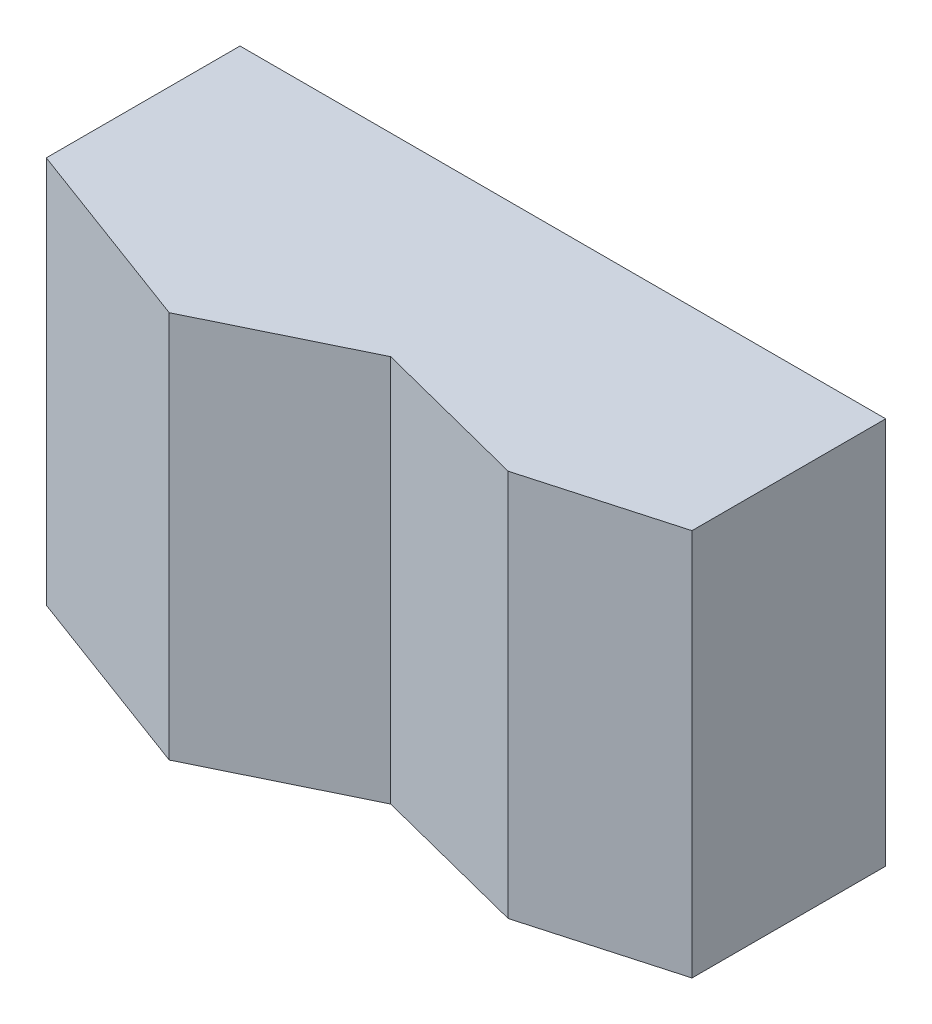
ISO-10303-21;
HEADER;
FILE_DESCRIPTION(('STEP AP214'),'2;1');
FILE_NAME('part.step','',(''),(''),'','','');
FILE_SCHEMA(('AUTOMOTIVE_DESIGN { 1 0 10303 214 1 1 1 1 }'));
ENDSEC;
DATA;
#1=APPLICATION_CONTEXT('core data for automotive mechanical design processes');
#2=APPLICATION_PROTOCOL_DEFINITION('international standard','automotive_design',2000,#1);
#3=PRODUCT_CONTEXT('',#1,'mechanical');
#4=PRODUCT('Part','Part','',(#3));
#5=PRODUCT_RELATED_PRODUCT_CATEGORY('part','',(#4));
#6=PRODUCT_DEFINITION_FORMATION('','',#4);
#7=PRODUCT_DEFINITION_CONTEXT('part definition',#1,'design');
#8=PRODUCT_DEFINITION('design','',#6,#7);
#9=PRODUCT_DEFINITION_SHAPE('','',#8);
#10=(LENGTH_UNIT() NAMED_UNIT(*) SI_UNIT(.MILLI.,.METRE.));
#11=(NAMED_UNIT(*) PLANE_ANGLE_UNIT() SI_UNIT($,.RADIAN.));
#12=(NAMED_UNIT(*) SI_UNIT($,.STERADIAN.) SOLID_ANGLE_UNIT());
#13=UNCERTAINTY_MEASURE_WITH_UNIT(LENGTH_MEASURE(1.E-05),#10,'distance_accuracy_value','');
#14=(GEOMETRIC_REPRESENTATION_CONTEXT(3) GLOBAL_UNCERTAINTY_ASSIGNED_CONTEXT((#13)) GLOBAL_UNIT_ASSIGNED_CONTEXT((#10,
#11,#12)) REPRESENTATION_CONTEXT('',''));
#15=CARTESIAN_POINT('',(0.,0.,0.));
#16=DIRECTION('',(0.,0.,1.));
#17=DIRECTION('',(1.,0.,0.));
#18=AXIS2_PLACEMENT_3D('',#15,#16,#17);
#19=CARTESIAN_POINT('',(0.,0.,3.));
#20=DIRECTION('',(1.,0.,0.));
#21=DIRECTION('',(0.,0.,-1.));
#22=AXIS2_PLACEMENT_3D('',#19,#20,#21);
#23=PLANE('',#22);
#24=DIRECTION('',(0.,-1.,0.));
#25=VECTOR('',#24,1.);
#26=CARTESIAN_POINT('',(0.,0.,0.));
#27=LINE('',#26,#25);
#28=CARTESIAN_POINT('',(0.,6.,0.));
#29=VERTEX_POINT('',#28);
#30=CARTESIAN_POINT('',(0.,0.,0.));
#31=VERTEX_POINT('',#30);
#32=EDGE_CURVE('E275',#29,#31,#27,.T.);
#33=ORIENTED_EDGE('',*,*,#32,.T.);
#34=DIRECTION('',(0.,0.,-1.));
#35=VECTOR('',#34,1.);
#36=CARTESIAN_POINT('',(0.,0.,3.));
#37=LINE('',#36,#35);
#38=CARTESIAN_POINT('',(0.,0.,3.));
#39=VERTEX_POINT('',#38);
#40=EDGE_CURVE('E11',#39,#31,#37,.T.);
#41=ORIENTED_EDGE('',*,*,#40,.F.);
#42=DIRECTION('',(0.,-1.,0.));
#43=VECTOR('',#42,1.);
#44=CARTESIAN_POINT('',(0.,0.,3.));
#45=LINE('',#44,#43);
#46=CARTESIAN_POINT('',(0.,6.,3.));
#47=VERTEX_POINT('',#46);
#48=EDGE_CURVE('E279',#47,#39,#45,.T.);
#49=ORIENTED_EDGE('',*,*,#48,.F.);
#50=DIRECTION('',(0.,0.,-1.));
#51=VECTOR('',#50,1.);
#52=CARTESIAN_POINT('',(0.,6.,3.));
#53=LINE('',#52,#51);
#54=EDGE_CURVE('E287',#47,#29,#53,.T.);
#55=ORIENTED_EDGE('',*,*,#54,.T.);
#56=EDGE_LOOP('',(#33,#41,#49,#55));
#57=FACE_BOUND('',#56,.T.);
#58=ADVANCED_FACE('F41',(#57),#23,.F.);
#59=CARTESIAN_POINT('',(0.,0.,3.));
#60=DIRECTION('',(0.,1.,0.));
#61=DIRECTION('',(0.,0.,1.));
#62=AXIS2_PLACEMENT_3D('',#59,#60,#61);
#63=PLANE('',#62);
#64=DIRECTION('',(1.,0.,0.));
#65=VECTOR('',#64,1.);
#66=CARTESIAN_POINT('',(0.,0.,0.));
#67=LINE('',#66,#65);
#68=CARTESIAN_POINT('',(10.,0.,0.));
#69=VERTEX_POINT('',#68);
#70=EDGE_CURVE('E291',#31,#69,#67,.T.);
#71=ORIENTED_EDGE('',*,*,#70,.T.);
#72=DIRECTION('',(0.,0.,-1.));
#73=VECTOR('',#72,1.);
#74=CARTESIAN_POINT('',(10.,0.,3.));
#75=LINE('',#74,#73);
#76=CARTESIAN_POINT('',(10.,0.,3.));
#77=VERTEX_POINT('',#76);
#78=EDGE_CURVE('E49',#77,#69,#75,.T.);
#79=ORIENTED_EDGE('',*,*,#78,.F.);
#80=DIRECTION('',(0.962490655943044,0.,-0.271314830450401));
#81=VECTOR('',#80,1.);
#82=CARTESIAN_POINT('',(1.51953133960514,0.,5.39054467960583));
#83=LINE('',#82,#81);
#84=CARTESIAN_POINT('',(7.77951864190933,0.,3.62592765910893));
#85=VERTEX_POINT('',#84);
#86=EDGE_CURVE('E194',#85,#77,#83,.T.);
#87=ORIENTED_EDGE('',*,*,#86,.F.);
#88=DIRECTION('',(0.968775623637578,0.,0.247939087369505));
#89=VECTOR('',#88,1.);
#90=CARTESIAN_POINT('',(-0.39270168979148,0.,1.53440842453493));
#91=LINE('',#90,#89);
#92=CARTESIAN_POINT('',(5.33382335143032,0.,3.));
#93=VERTEX_POINT('',#92);
#94=EDGE_CURVE('E245',#93,#85,#91,.T.);
#95=ORIENTED_EDGE('',*,*,#94,.F.);
#96=DIRECTION('',(0.8986995930781,0.,-0.438564751663034));
#97=VECTOR('',#96,1.);
#98=CARTESIAN_POINT('',(2.20831636199165,0.,4.52524515110705));
#99=LINE('',#98,#97);
#100=CARTESIAN_POINT('',(3.02868526155356,0.,4.12490572124689));
#101=VERTEX_POINT('',#100);
#102=EDGE_CURVE('E255',#101,#93,#99,.T.);
#103=ORIENTED_EDGE('',*,*,#102,.F.);
#104=DIRECTION('',(0.937428759251605,0.,0.348177140731548));
#105=VECTOR('',#104,1.);
#106=CARTESIAN_POINT('',(-0.979173795107241,0.,2.63631803601601));
#107=LINE('',#106,#105);
#108=EDGE_CURVE('E263',#39,#101,#107,.T.);
#109=ORIENTED_EDGE('',*,*,#108,.F.);
#110=ORIENTED_EDGE('',*,*,#40,.T.);
#111=EDGE_LOOP('',(#71,#79,#87,#95,#103,#109,#110));
#112=FACE_BOUND('',#111,.T.);
#113=ADVANCED_FACE('F328',(#112),#63,.F.);
#114=CARTESIAN_POINT('',(10.,0.,3.));
#115=DIRECTION('',(-1.,0.,0.));
#116=DIRECTION('',(0.,0.,1.));
#117=AXIS2_PLACEMENT_3D('',#114,#115,#116);
#118=PLANE('',#117);
#119=DIRECTION('',(0.,1.,0.));
#120=VECTOR('',#119,1.);
#121=CARTESIAN_POINT('',(10.,0.,0.));
#122=LINE('',#121,#120);
#123=CARTESIAN_POINT('',(10.,6.,0.));
#124=VERTEX_POINT('',#123);
#125=EDGE_CURVE('E294',#69,#124,#122,.T.);
#126=ORIENTED_EDGE('',*,*,#125,.T.);
#127=DIRECTION('',(0.,0.,-1.));
#128=VECTOR('',#127,1.);
#129=CARTESIAN_POINT('',(10.,6.,3.));
#130=LINE('',#129,#128);
#131=CARTESIAN_POINT('',(10.,6.,3.));
#132=VERTEX_POINT('',#131);
#133=EDGE_CURVE('E302',#132,#124,#130,.T.);
#134=ORIENTED_EDGE('',*,*,#133,.F.);
#135=DIRECTION('',(0.,1.,0.));
#136=VECTOR('',#135,1.);
#137=CARTESIAN_POINT('',(10.,0.,3.));
#138=LINE('',#137,#136);
#139=EDGE_CURVE('E282',#77,#132,#138,.T.);
#140=ORIENTED_EDGE('',*,*,#139,.F.);
#141=ORIENTED_EDGE('',*,*,#78,.T.);
#142=EDGE_LOOP('',(#126,#134,#140,#141));
#143=FACE_BOUND('',#142,.T.);
#144=ADVANCED_FACE('F310',(#143),#118,.F.);
#145=CARTESIAN_POINT('',(0.,6.,3.));
#146=DIRECTION('',(0.,-1.,0.));
#147=DIRECTION('',(0.,0.,-1.));
#148=AXIS2_PLACEMENT_3D('',#145,#146,#147);
#149=PLANE('',#148);
#150=DIRECTION('',(-1.,0.,0.));
#151=VECTOR('',#150,1.);
#152=CARTESIAN_POINT('',(0.,6.,0.));
#153=LINE('',#152,#151);
#154=EDGE_CURVE('E283',#124,#29,#153,.T.);
#155=ORIENTED_EDGE('',*,*,#154,.T.);
#156=ORIENTED_EDGE('',*,*,#54,.F.);
#157=DIRECTION('',(0.937428759251605,0.,0.348177140731548));
#158=VECTOR('',#157,1.);
#159=CARTESIAN_POINT('',(-0.979173795107241,6.,2.63631803601601));
#160=LINE('',#159,#158);
#161=CARTESIAN_POINT('',(3.02868526155356,6.,4.12490572124689));
#162=VERTEX_POINT('',#161);
#163=EDGE_CURVE('E262',#47,#162,#160,.T.);
#164=ORIENTED_EDGE('',*,*,#163,.T.);
#165=DIRECTION('',(0.8986995930781,0.,-0.438564751663034));
#166=VECTOR('',#165,1.);
#167=CARTESIAN_POINT('',(2.20831636199165,6.,4.52524515110705));
#168=LINE('',#167,#166);
#169=CARTESIAN_POINT('',(5.33382335143032,6.,3.));
#170=VERTEX_POINT('',#169);
#171=EDGE_CURVE('E259',#162,#170,#168,.T.);
#172=ORIENTED_EDGE('',*,*,#171,.T.);
#173=DIRECTION('',(0.968775623637578,0.,0.247939087369505));
#174=VECTOR('',#173,1.);
#175=CARTESIAN_POINT('',(-0.39270168979148,6.,1.53440842453493));
#176=LINE('',#175,#174);
#177=CARTESIAN_POINT('',(7.77951864190933,6.,3.62592765910893));
#178=VERTEX_POINT('',#177);
#179=EDGE_CURVE('E252',#170,#178,#176,.T.);
#180=ORIENTED_EDGE('',*,*,#179,.T.);
#181=DIRECTION('',(0.962490655943044,0.,-0.271314830450401));
#182=VECTOR('',#181,1.);
#183=CARTESIAN_POINT('',(1.51953133960514,6.,5.39054467960583));
#184=LINE('',#183,#182);
#185=EDGE_CURVE('E248',#178,#132,#184,.T.);
#186=ORIENTED_EDGE('',*,*,#185,.T.);
#187=ORIENTED_EDGE('',*,*,#133,.T.);
#188=EDGE_LOOP('',(#155,#156,#164,#172,#180,#186,#187));
#189=FACE_BOUND('',#188,.T.);
#190=ADVANCED_FACE('F319',(#189),#149,.F.);
#191=CARTESIAN_POINT('',(0.,0.,0.));
#192=DIRECTION('',(0.,0.,-1.));
#193=DIRECTION('',(-1.,0.,0.));
#194=AXIS2_PLACEMENT_3D('',#191,#192,#193);
#195=PLANE('',#194);
#196=DIRECTION('',(0.,-1.,0.));
#197=VECTOR('',#196,1.);
#198=CARTESIAN_POINT('',(3.,4.5,0.));
#199=LINE('',#198,#197);
#200=CARTESIAN_POINT('',(3.,4.5,0.));
#201=VERTEX_POINT('',#200);
#202=CARTESIAN_POINT('',(3.,2.5,0.));
#203=VERTEX_POINT('',#202);
#204=EDGE_CURVE('E56',#201,#203,#199,.T.);
#205=ORIENTED_EDGE('',*,*,#204,.F.);
#206=DIRECTION('',(1.,0.,0.));
#207=VECTOR('',#206,1.);
#208=CARTESIAN_POINT('',(3.,4.5,0.));
#209=LINE('',#208,#207);
#210=CARTESIAN_POINT('',(2.5,4.5,0.));
#211=VERTEX_POINT('',#210);
#212=EDGE_CURVE('E171',#211,#201,#209,.T.);
#213=ORIENTED_EDGE('',*,*,#212,.F.);
#214=DIRECTION('',(0.,1.,0.));
#215=VECTOR('',#214,1.);
#216=CARTESIAN_POINT('',(2.5,4.5,0.));
#217=LINE('',#216,#215);
#218=CARTESIAN_POINT('',(2.5,2.5,0.));
#219=VERTEX_POINT('',#218);
#220=EDGE_CURVE('E175',#219,#211,#217,.T.);
#221=ORIENTED_EDGE('',*,*,#220,.F.);
#222=DIRECTION('',(-1.,0.,0.));
#223=VECTOR('',#222,1.);
#224=CARTESIAN_POINT('',(3.,2.5,0.));
#225=LINE('',#224,#223);
#226=EDGE_CURVE('E184',#203,#219,#225,.T.);
#227=ORIENTED_EDGE('',*,*,#226,.F.);
#228=EDGE_LOOP('',(#205,#213,#221,#227));
#229=FACE_BOUND('',#228,.T.);
#230=DIRECTION('',(0.,-1.,0.));
#231=VECTOR('',#230,1.);
#232=CARTESIAN_POINT('',(7.,4.5,0.));
#233=LINE('',#232,#231);
#234=CARTESIAN_POINT('',(7.,4.5,0.));
#235=VERTEX_POINT('',#234);
#236=CARTESIAN_POINT('',(7.,1.5,0.));
#237=VERTEX_POINT('',#236);
#238=EDGE_CURVE('E64',#235,#237,#233,.T.);
#239=ORIENTED_EDGE('',*,*,#238,.F.);
#240=DIRECTION('',(1.,0.,0.));
#241=VECTOR('',#240,1.);
#242=CARTESIAN_POINT('',(7.,4.5,0.));
#243=LINE('',#242,#241);
#244=CARTESIAN_POINT('',(6.,4.5,0.));
#245=VERTEX_POINT('',#244);
#246=EDGE_CURVE('E205',#245,#235,#243,.T.);
#247=ORIENTED_EDGE('',*,*,#246,.F.);
#248=DIRECTION('',(0.,1.,0.));
#249=VECTOR('',#248,1.);
#250=CARTESIAN_POINT('',(6.,4.5,0.));
#251=LINE('',#250,#249);
#252=CARTESIAN_POINT('',(6.,1.5,0.));
#253=VERTEX_POINT('',#252);
#254=EDGE_CURVE('E224',#253,#245,#251,.T.);
#255=ORIENTED_EDGE('',*,*,#254,.F.);
#256=DIRECTION('',(-1.,0.,0.));
#257=VECTOR('',#256,1.);
#258=CARTESIAN_POINT('',(7.,1.5,0.));
#259=LINE('',#258,#257);
#260=EDGE_CURVE('E220',#237,#253,#259,.T.);
#261=ORIENTED_EDGE('',*,*,#260,.F.);
#262=EDGE_LOOP('',(#239,#247,#255,#261));
#263=FACE_BOUND('',#262,.T.);
#264=ORIENTED_EDGE('',*,*,#32,.F.);
#265=ORIENTED_EDGE('',*,*,#154,.F.);
#266=ORIENTED_EDGE('',*,*,#125,.F.);
#267=ORIENTED_EDGE('',*,*,#70,.F.);
#268=EDGE_LOOP('',(#264,#265,#266,#267));
#269=FACE_BOUND('',#268,.T.);
#270=ADVANCED_FACE('F316',(#229,#263,#269),#195,.T.);
#271=CARTESIAN_POINT('',(2.20831636199165,6.,4.52524515110705));
#272=DIRECTION('',(-0.438564751663034,0.,-0.8986995930781));
#273=DIRECTION('',(-0.8986995930781,0.,0.438564751663034));
#274=AXIS2_PLACEMENT_3D('',#271,#272,#273);
#275=PLANE('',#274);
#276=ORIENTED_EDGE('',*,*,#102,.T.);
#277=DIRECTION('',(0.,-1.,0.));
#278=VECTOR('',#277,1.);
#279=CARTESIAN_POINT('',(5.33382335143032,6.,3.));
#280=LINE('',#279,#278);
#281=EDGE_CURVE('E271',#170,#93,#280,.T.);
#282=ORIENTED_EDGE('',*,*,#281,.F.);
#283=ORIENTED_EDGE('',*,*,#171,.F.);
#284=DIRECTION('',(0.,-1.,0.));
#285=VECTOR('',#284,1.);
#286=CARTESIAN_POINT('',(3.02868526155356,6.,4.12490572124689));
#287=LINE('',#286,#285);
#288=EDGE_CURVE('E266',#162,#101,#287,.T.);
#289=ORIENTED_EDGE('',*,*,#288,.T.);
#290=EDGE_LOOP('',(#276,#282,#283,#289));
#291=FACE_BOUND('',#290,.T.);
#292=ADVANCED_FACE('F332',(#291),#275,.F.);
#293=CARTESIAN_POINT('',(-0.979173795107241,6.,2.63631803601601));
#294=DIRECTION('',(0.348177140731548,0.,-0.937428759251605));
#295=DIRECTION('',(-0.937428759251605,0.,-0.348177140731548));
#296=AXIS2_PLACEMENT_3D('',#293,#294,#295);
#297=PLANE('',#296);
#298=ORIENTED_EDGE('',*,*,#108,.T.);
#299=ORIENTED_EDGE('',*,*,#288,.F.);
#300=ORIENTED_EDGE('',*,*,#163,.F.);
#301=ORIENTED_EDGE('',*,*,#48,.T.);
#302=EDGE_LOOP('',(#298,#299,#300,#301));
#303=FACE_BOUND('',#302,.T.);
#304=ADVANCED_FACE('F325',(#303),#297,.F.);
#305=CARTESIAN_POINT('',(1.51953133960514,6.,5.39054467960583));
#306=DIRECTION('',(-0.271314830450401,0.,-0.962490655943044));
#307=DIRECTION('',(-0.962490655943044,0.,0.271314830450401));
#308=AXIS2_PLACEMENT_3D('',#305,#306,#307);
#309=PLANE('',#308);
#310=ORIENTED_EDGE('',*,*,#86,.T.);
#311=ORIENTED_EDGE('',*,*,#139,.T.);
#312=ORIENTED_EDGE('',*,*,#185,.F.);
#313=DIRECTION('',(0.,-1.,0.));
#314=VECTOR('',#313,1.);
#315=CARTESIAN_POINT('',(7.77951864190933,6.,3.62592765910893));
#316=LINE('',#315,#314);
#317=EDGE_CURVE('E241',#178,#85,#316,.T.);
#318=ORIENTED_EDGE('',*,*,#317,.T.);
#319=EDGE_LOOP('',(#310,#311,#312,#318));
#320=FACE_BOUND('',#319,.T.);
#321=ADVANCED_FACE('F340',(#320),#309,.F.);
#322=CARTESIAN_POINT('',(-0.39270168979148,6.,1.53440842453493));
#323=DIRECTION('',(0.247939087369505,0.,-0.968775623637577));
#324=DIRECTION('',(-0.968775623637578,0.,-0.247939087369505));
#325=AXIS2_PLACEMENT_3D('',#322,#323,#324);
#326=PLANE('',#325);
#327=ORIENTED_EDGE('',*,*,#94,.T.);
#328=ORIENTED_EDGE('',*,*,#317,.F.);
#329=ORIENTED_EDGE('',*,*,#179,.F.);
#330=ORIENTED_EDGE('',*,*,#281,.T.);
#331=EDGE_LOOP('',(#327,#328,#329,#330));
#332=FACE_BOUND('',#331,.T.);
#333=ADVANCED_FACE('F336',(#332),#326,.F.);
#334=CARTESIAN_POINT('',(7.,4.5,1.5));
#335=DIRECTION('',(1.,0.,0.));
#336=DIRECTION('',(0.,0.,-1.));
#337=AXIS2_PLACEMENT_3D('',#334,#335,#336);
#338=PLANE('',#337);
#339=ORIENTED_EDGE('',*,*,#238,.T.);
#340=DIRECTION('',(0.,0.,-1.));
#341=VECTOR('',#340,1.);
#342=CARTESIAN_POINT('',(7.,1.5,1.5));
#343=LINE('',#342,#341);
#344=CARTESIAN_POINT('',(7.,1.5,1.5));
#345=VERTEX_POINT('',#344);
#346=EDGE_CURVE('E217',#345,#237,#343,.T.);
#347=ORIENTED_EDGE('',*,*,#346,.F.);
#348=DIRECTION('',(0.,-1.,0.));
#349=VECTOR('',#348,1.);
#350=CARTESIAN_POINT('',(7.,4.5,1.5));
#351=LINE('',#350,#349);
#352=CARTESIAN_POINT('',(7.,4.5,1.5));
#353=VERTEX_POINT('',#352);
#354=EDGE_CURVE('E200',#353,#345,#351,.T.);
#355=ORIENTED_EDGE('',*,*,#354,.F.);
#356=DIRECTION('',(0.,0.,-1.));
#357=VECTOR('',#356,1.);
#358=CARTESIAN_POINT('',(7.,4.5,1.5));
#359=LINE('',#358,#357);
#360=EDGE_CURVE('E185',#353,#235,#359,.T.);
#361=ORIENTED_EDGE('',*,*,#360,.T.);
#362=EDGE_LOOP('',(#339,#347,#355,#361));
#363=FACE_BOUND('',#362,.T.);
#364=ADVANCED_FACE('F347',(#363),#338,.F.);
#365=CARTESIAN_POINT('',(7.,4.5,1.5));
#366=DIRECTION('',(0.,1.,0.));
#367=DIRECTION('',(0.,0.,1.));
#368=AXIS2_PLACEMENT_3D('',#365,#366,#367);
#369=PLANE('',#368);
#370=ORIENTED_EDGE('',*,*,#246,.T.);
#371=ORIENTED_EDGE('',*,*,#360,.F.);
#372=DIRECTION('',(1.,0.,0.));
#373=VECTOR('',#372,1.);
#374=CARTESIAN_POINT('',(7.,4.5,1.5));
#375=LINE('',#374,#373);
#376=CARTESIAN_POINT('',(6.,4.5,1.5));
#377=VERTEX_POINT('',#376);
#378=EDGE_CURVE('E213',#377,#353,#375,.T.);
#379=ORIENTED_EDGE('',*,*,#378,.F.);
#380=DIRECTION('',(0.,0.,-1.));
#381=VECTOR('',#380,1.);
#382=CARTESIAN_POINT('',(6.,4.5,1.5));
#383=LINE('',#382,#381);
#384=EDGE_CURVE('E233',#377,#245,#383,.T.);
#385=ORIENTED_EDGE('',*,*,#384,.T.);
#386=EDGE_LOOP('',(#370,#371,#379,#385));
#387=FACE_BOUND('',#386,.T.);
#388=ADVANCED_FACE('F400',(#387),#369,.F.);
#389=CARTESIAN_POINT('',(6.,4.5,1.5));
#390=DIRECTION('',(-1.,0.,0.));
#391=DIRECTION('',(0.,-1.,0.));
#392=AXIS2_PLACEMENT_3D('',#389,#390,#391);
#393=PLANE('',#392);
#394=ORIENTED_EDGE('',*,*,#254,.T.);
#395=ORIENTED_EDGE('',*,*,#384,.F.);
#396=DIRECTION('',(0.,1.,0.));
#397=VECTOR('',#396,1.);
#398=CARTESIAN_POINT('',(6.,4.5,1.5));
#399=LINE('',#398,#397);
#400=CARTESIAN_POINT('',(6.,1.5,1.5));
#401=VERTEX_POINT('',#400);
#402=EDGE_CURVE('E209',#401,#377,#399,.T.);
#403=ORIENTED_EDGE('',*,*,#402,.F.);
#404=DIRECTION('',(0.,0.,-1.));
#405=VECTOR('',#404,1.);
#406=CARTESIAN_POINT('',(6.,1.5,1.5));
#407=LINE('',#406,#405);
#408=EDGE_CURVE('E236',#401,#253,#407,.T.);
#409=ORIENTED_EDGE('',*,*,#408,.T.);
#410=EDGE_LOOP('',(#394,#395,#403,#409));
#411=FACE_BOUND('',#410,.T.);
#412=ADVANCED_FACE('F408',(#411),#393,.F.);
#413=CARTESIAN_POINT('',(7.,1.5,1.5));
#414=DIRECTION('',(0.,-1.,0.));
#415=DIRECTION('',(0.,0.,-1.));
#416=AXIS2_PLACEMENT_3D('',#413,#414,#415);
#417=PLANE('',#416);
#418=ORIENTED_EDGE('',*,*,#260,.T.);
#419=ORIENTED_EDGE('',*,*,#408,.F.);
#420=DIRECTION('',(-1.,0.,0.));
#421=VECTOR('',#420,1.);
#422=CARTESIAN_POINT('',(7.,1.5,1.5));
#423=LINE('',#422,#421);
#424=EDGE_CURVE('E204',#345,#401,#423,.T.);
#425=ORIENTED_EDGE('',*,*,#424,.F.);
#426=ORIENTED_EDGE('',*,*,#346,.T.);
#427=EDGE_LOOP('',(#418,#419,#425,#426));
#428=FACE_BOUND('',#427,.T.);
#429=ADVANCED_FACE('F418',(#428),#417,.F.);
#430=CARTESIAN_POINT('',(0.,0.,1.5));
#431=DIRECTION('',(0.,0.,-1.));
#432=DIRECTION('',(-1.,0.,0.));
#433=AXIS2_PLACEMENT_3D('',#430,#431,#432);
#434=PLANE('',#433);
#435=ORIENTED_EDGE('',*,*,#354,.T.);
#436=ORIENTED_EDGE('',*,*,#424,.T.);
#437=ORIENTED_EDGE('',*,*,#402,.T.);
#438=ORIENTED_EDGE('',*,*,#378,.T.);
#439=EDGE_LOOP('',(#435,#436,#437,#438));
#440=FACE_BOUND('',#439,.T.);
#441=ADVANCED_FACE('F428',(#440),#434,.T.);
#442=CARTESIAN_POINT('',(3.,4.5,1.5));
#443=DIRECTION('',(1.,0.,0.));
#444=DIRECTION('',(0.,1.,0.));
#445=AXIS2_PLACEMENT_3D('',#442,#443,#444);
#446=PLANE('',#445);
#447=ORIENTED_EDGE('',*,*,#204,.T.);
#448=DIRECTION('',(0.,0.,-1.));
#449=VECTOR('',#448,1.);
#450=CARTESIAN_POINT('',(3.,2.5,1.5));
#451=LINE('',#450,#449);
#452=CARTESIAN_POINT('',(3.,2.5,1.5));
#453=VERTEX_POINT('',#452);
#454=EDGE_CURVE('E146',#453,#203,#451,.T.);
#455=ORIENTED_EDGE('',*,*,#454,.F.);
#456=DIRECTION('',(0.,-1.,0.));
#457=VECTOR('',#456,1.);
#458=CARTESIAN_POINT('',(3.,4.5,1.5));
#459=LINE('',#458,#457);
#460=CARTESIAN_POINT('',(3.,4.5,1.5));
#461=VERTEX_POINT('',#460);
#462=EDGE_CURVE('E150',#461,#453,#459,.T.);
#463=ORIENTED_EDGE('',*,*,#462,.F.);
#464=DIRECTION('',(0.,0.,-1.));
#465=VECTOR('',#464,1.);
#466=CARTESIAN_POINT('',(3.,4.5,1.5));
#467=LINE('',#466,#465);
#468=EDGE_CURVE('E191',#461,#201,#467,.T.);
#469=ORIENTED_EDGE('',*,*,#468,.T.);
#470=EDGE_LOOP('',(#447,#455,#463,#469));
#471=FACE_BOUND('',#470,.T.);
#472=ADVANCED_FACE('F148',(#471),#446,.F.);
#473=CARTESIAN_POINT('',(3.,4.5,1.5));
#474=DIRECTION('',(0.,1.,0.));
#475=DIRECTION('',(0.,0.,1.));
#476=AXIS2_PLACEMENT_3D('',#473,#474,#475);
#477=PLANE('',#476);
#478=ORIENTED_EDGE('',*,*,#212,.T.);
#479=ORIENTED_EDGE('',*,*,#468,.F.);
#480=DIRECTION('',(1.,0.,0.));
#481=VECTOR('',#480,1.);
#482=CARTESIAN_POINT('',(3.,4.5,1.5));
#483=LINE('',#482,#481);
#484=CARTESIAN_POINT('',(2.5,4.5,1.5));
#485=VERTEX_POINT('',#484);
#486=EDGE_CURVE('E157',#485,#461,#483,.T.);
#487=ORIENTED_EDGE('',*,*,#486,.F.);
#488=DIRECTION('',(0.,0.,-1.));
#489=VECTOR('',#488,1.);
#490=CARTESIAN_POINT('',(2.5,4.5,1.5));
#491=LINE('',#490,#489);
#492=EDGE_CURVE('E195',#485,#211,#491,.T.);
#493=ORIENTED_EDGE('',*,*,#492,.T.);
#494=EDGE_LOOP('',(#478,#479,#487,#493));
#495=FACE_BOUND('',#494,.T.);
#496=ADVANCED_FACE('F447',(#495),#477,.F.);
#497=CARTESIAN_POINT('',(2.5,4.5,1.5));
#498=DIRECTION('',(-1.,0.,0.));
#499=DIRECTION('',(0.,-1.,0.));
#500=AXIS2_PLACEMENT_3D('',#497,#498,#499);
#501=PLANE('',#500);
#502=ORIENTED_EDGE('',*,*,#220,.T.);
#503=ORIENTED_EDGE('',*,*,#492,.F.);
#504=DIRECTION('',(0.,1.,0.));
#505=VECTOR('',#504,1.);
#506=CARTESIAN_POINT('',(2.5,4.5,1.5));
#507=LINE('',#506,#505);
#508=CARTESIAN_POINT('',(2.5,2.5,1.5));
#509=VERTEX_POINT('',#508);
#510=EDGE_CURVE('E166',#509,#485,#507,.T.);
#511=ORIENTED_EDGE('',*,*,#510,.F.);
#512=DIRECTION('',(0.,0.,-1.));
#513=VECTOR('',#512,1.);
#514=CARTESIAN_POINT('',(2.5,2.5,1.5));
#515=LINE('',#514,#513);
#516=EDGE_CURVE('E156',#509,#219,#515,.T.);
#517=ORIENTED_EDGE('',*,*,#516,.T.);
#518=EDGE_LOOP('',(#502,#503,#511,#517));
#519=FACE_BOUND('',#518,.T.);
#520=ADVANCED_FACE('F456',(#519),#501,.F.);
#521=CARTESIAN_POINT('',(3.,2.5,1.5));
#522=DIRECTION('',(0.,-1.,0.));
#523=DIRECTION('',(0.,0.,-1.));
#524=AXIS2_PLACEMENT_3D('',#521,#522,#523);
#525=PLANE('',#524);
#526=ORIENTED_EDGE('',*,*,#226,.T.);
#527=ORIENTED_EDGE('',*,*,#516,.F.);
#528=DIRECTION('',(-1.,0.,0.));
#529=VECTOR('',#528,1.);
#530=CARTESIAN_POINT('',(3.,2.5,1.5));
#531=LINE('',#530,#529);
#532=EDGE_CURVE('E160',#453,#509,#531,.T.);
#533=ORIENTED_EDGE('',*,*,#532,.F.);
#534=ORIENTED_EDGE('',*,*,#454,.T.);
#535=EDGE_LOOP('',(#526,#527,#533,#534));
#536=FACE_BOUND('',#535,.T.);
#537=ADVANCED_FACE('F161',(#536),#525,.F.);
#538=CARTESIAN_POINT('',(0.,0.,1.5));
#539=DIRECTION('',(0.,0.,-1.));
#540=DIRECTION('',(-1.,0.,0.));
#541=AXIS2_PLACEMENT_3D('',#538,#539,#540);
#542=PLANE('',#541);
#543=ORIENTED_EDGE('',*,*,#462,.T.);
#544=ORIENTED_EDGE('',*,*,#532,.T.);
#545=ORIENTED_EDGE('',*,*,#510,.T.);
#546=ORIENTED_EDGE('',*,*,#486,.T.);
#547=EDGE_LOOP('',(#543,#544,#545,#546));
#548=FACE_BOUND('',#547,.T.);
#549=ADVANCED_FACE('F168',(#548),#542,.T.);
#550=CLOSED_SHELL('',(#58,#113,#144,#190,#270,#292,#304,#321,#333,#364,#388,#412,#429,#441,#472,
#496,#520,#537,#549));
#551=MANIFOLD_SOLID_BREP('B2',#550);
#552=ADVANCED_BREP_SHAPE_REPRESENTATION('',(#18,#551),#14);
#553=SHAPE_DEFINITION_REPRESENTATION(#9,#552);
ENDSEC;
END-ISO-10303-21;
